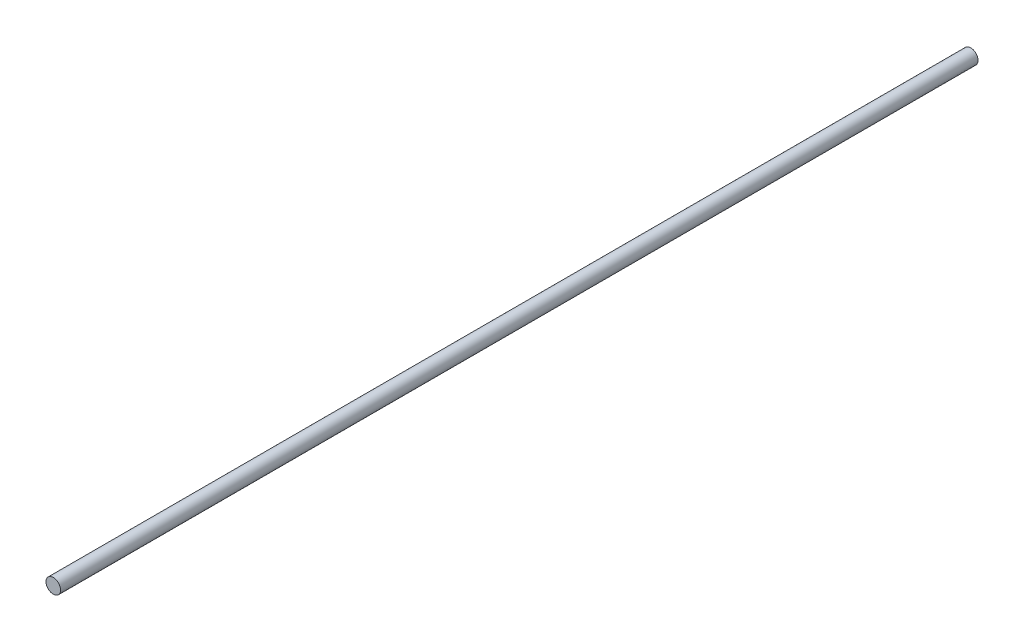
ISO-10303-21;
HEADER;
FILE_DESCRIPTION(('STEP AP214'),'2;1');
FILE_NAME('part.step','',(''),(''),'','','');
FILE_SCHEMA(('AUTOMOTIVE_DESIGN { 1 0 10303 214 1 1 1 1 }'));
ENDSEC;
DATA;
#1=APPLICATION_CONTEXT('core data for automotive mechanical design processes');
#2=APPLICATION_PROTOCOL_DEFINITION('international standard','automotive_design',2000,#1);
#3=PRODUCT_CONTEXT('',#1,'mechanical');
#4=PRODUCT('Part','Part','',(#3));
#5=PRODUCT_RELATED_PRODUCT_CATEGORY('part','',(#4));
#6=PRODUCT_DEFINITION_FORMATION('','',#4);
#7=PRODUCT_DEFINITION_CONTEXT('part definition',#1,'design');
#8=PRODUCT_DEFINITION('design','',#6,#7);
#9=PRODUCT_DEFINITION_SHAPE('','',#8);
#10=(LENGTH_UNIT() NAMED_UNIT(*) SI_UNIT(.MILLI.,.METRE.));
#11=(NAMED_UNIT(*) PLANE_ANGLE_UNIT() SI_UNIT($,.RADIAN.));
#12=(NAMED_UNIT(*) SI_UNIT($,.STERADIAN.) SOLID_ANGLE_UNIT());
#13=UNCERTAINTY_MEASURE_WITH_UNIT(LENGTH_MEASURE(1.E-05),#10,'distance_accuracy_value','');
#14=(GEOMETRIC_REPRESENTATION_CONTEXT(3) GLOBAL_UNCERTAINTY_ASSIGNED_CONTEXT((#13)) GLOBAL_UNIT_ASSIGNED_CONTEXT((#10,
#11,#12)) REPRESENTATION_CONTEXT('',''));
#15=CARTESIAN_POINT('',(0.,0.,0.));
#16=DIRECTION('',(0.,0.,1.));
#17=DIRECTION('',(1.,0.,0.));
#18=AXIS2_PLACEMENT_3D('',#15,#16,#17);
#19=CARTESIAN_POINT('',(0.,0.,200.025));
#20=DIRECTION('',(0.,0.,-1.));
#21=DIRECTION('',(-1.,0.,0.));
#22=AXIS2_PLACEMENT_3D('',#19,#20,#21);
#23=CYLINDRICAL_SURFACE('',#22,3.175);
#24=CARTESIAN_POINT('',(0.,0.,200.025));
#25=DIRECTION('',(0.,0.,1.));
#26=DIRECTION('',(1.,0.,0.));
#27=AXIS2_PLACEMENT_3D('',#24,#25,#26);
#28=CIRCLE('',#27,3.175);
#29=CARTESIAN_POINT('',(-3.175,0.,200.025));
#30=VERTEX_POINT('',#29);
#31=EDGE_CURVE('E10',#30,#30,#28,.T.);
#32=CARTESIAN_POINT('',(0.,0.,-200.025));
#33=DIRECTION('',(0.,0.,1.));
#34=DIRECTION('',(1.,0.,0.));
#35=AXIS2_PLACEMENT_3D('',#32,#33,#34);
#36=CIRCLE('',#35,3.175);
#37=CARTESIAN_POINT('',(-3.175,0.,-200.025));
#38=VERTEX_POINT('',#37);
#39=EDGE_CURVE('E37',#38,#38,#36,.T.);
#40=CARTESIAN_POINT('',(-3.175,0.,200.025));
#41=CARTESIAN_POINT('',(-3.175,0.,195.8578125));
#42=CARTESIAN_POINT('',(-3.175,0.,191.690625));
#43=CARTESIAN_POINT('',(-3.175,0.,183.35625));
#44=CARTESIAN_POINT('',(-3.175,0.,179.1890625));
#45=CARTESIAN_POINT('',(-3.175,0.,170.8546875));
#46=CARTESIAN_POINT('',(-3.175,0.,166.6875));
#47=CARTESIAN_POINT('',(-3.175,0.,158.353125));
#48=CARTESIAN_POINT('',(-3.175,0.,154.1859375));
#49=CARTESIAN_POINT('',(-3.175,0.,145.8515625));
#50=CARTESIAN_POINT('',(-3.175,0.,141.684375));
#51=CARTESIAN_POINT('',(-3.175,0.,133.35));
#52=CARTESIAN_POINT('',(-3.175,0.,129.1828125));
#53=CARTESIAN_POINT('',(-3.175,0.,120.8484375));
#54=CARTESIAN_POINT('',(-3.175,0.,116.68125));
#55=CARTESIAN_POINT('',(-3.175,0.,108.346875));
#56=CARTESIAN_POINT('',(-3.175,0.,104.1796875));
#57=CARTESIAN_POINT('',(-3.175,0.,95.8453125));
#58=CARTESIAN_POINT('',(-3.175,0.,91.678125));
#59=CARTESIAN_POINT('',(-3.175,0.,83.34375));
#60=CARTESIAN_POINT('',(-3.175,0.,79.1765625));
#61=CARTESIAN_POINT('',(-3.175,0.,70.8421875));
#62=CARTESIAN_POINT('',(-3.175,0.,66.675));
#63=CARTESIAN_POINT('',(-3.175,0.,58.340625));
#64=CARTESIAN_POINT('',(-3.175,0.,54.1734375));
#65=CARTESIAN_POINT('',(-3.175,0.,45.8390625));
#66=CARTESIAN_POINT('',(-3.175,0.,41.671875));
#67=CARTESIAN_POINT('',(-3.175,0.,33.3375));
#68=CARTESIAN_POINT('',(-3.175,0.,29.1703125));
#69=CARTESIAN_POINT('',(-3.175,0.,20.8359375));
#70=CARTESIAN_POINT('',(-3.175,0.,16.66875));
#71=CARTESIAN_POINT('',(-3.175,0.,8.33437499999998));
#72=CARTESIAN_POINT('',(-3.175,0.,4.16718749999997));
#73=CARTESIAN_POINT('',(-3.175,0.,-4.16718750000003));
#74=CARTESIAN_POINT('',(-3.175,0.,-8.33437500000003));
#75=CARTESIAN_POINT('',(-3.175,0.,-16.66875));
#76=CARTESIAN_POINT('',(-3.175,0.,-20.8359375));
#77=CARTESIAN_POINT('',(-3.175,0.,-29.1703125));
#78=CARTESIAN_POINT('',(-3.175,0.,-33.3375));
#79=CARTESIAN_POINT('',(-3.175,0.,-41.671875));
#80=CARTESIAN_POINT('',(-3.175,0.,-45.8390625));
#81=CARTESIAN_POINT('',(-3.175,0.,-54.1734375));
#82=CARTESIAN_POINT('',(-3.175,0.,-58.340625));
#83=CARTESIAN_POINT('',(-3.175,0.,-66.675));
#84=CARTESIAN_POINT('',(-3.175,0.,-70.8421875));
#85=CARTESIAN_POINT('',(-3.175,0.,-79.1765625));
#86=CARTESIAN_POINT('',(-3.175,0.,-83.34375));
#87=CARTESIAN_POINT('',(-3.175,0.,-91.678125));
#88=CARTESIAN_POINT('',(-3.175,0.,-95.8453125));
#89=CARTESIAN_POINT('',(-3.175,0.,-104.1796875));
#90=CARTESIAN_POINT('',(-3.175,0.,-108.346875));
#91=CARTESIAN_POINT('',(-3.175,0.,-116.68125));
#92=CARTESIAN_POINT('',(-3.175,0.,-120.8484375));
#93=CARTESIAN_POINT('',(-3.175,0.,-129.1828125));
#94=CARTESIAN_POINT('',(-3.175,0.,-133.35));
#95=CARTESIAN_POINT('',(-3.175,0.,-141.684375));
#96=CARTESIAN_POINT('',(-3.175,0.,-145.8515625));
#97=CARTESIAN_POINT('',(-3.175,0.,-154.1859375));
#98=CARTESIAN_POINT('',(-3.175,0.,-158.353125));
#99=CARTESIAN_POINT('',(-3.175,0.,-166.6875));
#100=CARTESIAN_POINT('',(-3.175,0.,-170.8546875));
#101=CARTESIAN_POINT('',(-3.175,0.,-179.1890625));
#102=CARTESIAN_POINT('',(-3.175,0.,-183.35625));
#103=CARTESIAN_POINT('',(-3.175,0.,-191.690625));
#104=CARTESIAN_POINT('',(-3.175,0.,-195.8578125));
#105=CARTESIAN_POINT('',(-3.175,0.,-200.025));
#106=B_SPLINE_CURVE_WITH_KNOTS('',3,(#40,#41,#42,#43,#44,#45,#46,#47,#48,#49,#50,#51,#52,#53,
#54,#55,#56,#57,#58,#59,#60,#61,#62,#63,#64,#65,#66,#67,#68,#69,#70,#71,#72,#73,#74,#75,#76,#77,
#78,#79,#80,#81,#82,#83,#84,#85,#86,#87,#88,#89,#90,#91,#92,#93,#94,#95,#96,#97,#98,#99,#100,
#101,#102,#103,#104,#105),.UNSPECIFIED.,.F.,.F.,(4,2,2,2,2,2,2,2,2,2,2,2,2,2,2,2,2,2,2,2,2,2,2,
2,2,2,2,2,2,2,2,2,4),(0.,12.5015625,25.003125,37.5046875,50.00625,62.5078125,75.009375,
87.5109375,100.0125,112.5140625,125.015625,137.5171875,150.01875,162.5203125,175.021875,
187.5234375,200.025,212.5265625,225.028125,237.5296875,250.03125,262.5328125,275.034375,
287.5359375,300.0375,312.5390625,325.040625,337.5421875,350.04375,362.5453125,375.046875,
387.5484375,400.05),.UNSPECIFIED.);
#107=EDGE_CURVE('BSEAM34',#30,#38,#106,.T.);
#108=ORIENTED_EDGE('',*,*,#31,.F.);
#109=ORIENTED_EDGE('',*,*,#39,.T.);
#110=ORIENTED_EDGE('',*,*,#107,.T.);
#111=ORIENTED_EDGE('',*,*,#107,.F.);
#112=EDGE_LOOP('',(#108,#110,#109,#111));
#113=FACE_BOUND('',#112,.T.);
#114=ADVANCED_FACE('F34',(#113),#23,.T.);
#115=CARTESIAN_POINT('',(0.,0.,200.025));
#116=DIRECTION('',(0.,0.,1.));
#117=DIRECTION('',(1.,0.,0.));
#118=AXIS2_PLACEMENT_3D('',#115,#116,#117);
#119=PLANE('',#118);
#120=ORIENTED_EDGE('',*,*,#31,.T.);
#121=EDGE_LOOP('',(#120));
#122=FACE_BOUND('',#121,.T.);
#123=ADVANCED_FACE('F49',(#122),#119,.T.);
#124=CARTESIAN_POINT('',(0.,0.,-200.025));
#125=DIRECTION('',(0.,0.,1.));
#126=DIRECTION('',(1.,0.,0.));
#127=AXIS2_PLACEMENT_3D('',#124,#125,#126);
#128=PLANE('',#127);
#129=ORIENTED_EDGE('',*,*,#39,.F.);
#130=EDGE_LOOP('',(#129));
#131=FACE_BOUND('',#130,.T.);
#132=ADVANCED_FACE('F47',(#131),#128,.F.);
#133=CLOSED_SHELL('',(#114,#123,#132));
#134=MANIFOLD_SOLID_BREP('B2',#133);
#135=ADVANCED_BREP_SHAPE_REPRESENTATION('',(#18,#134),#14);
#136=SHAPE_DEFINITION_REPRESENTATION(#9,#135);
ENDSEC;
END-ISO-10303-21;
